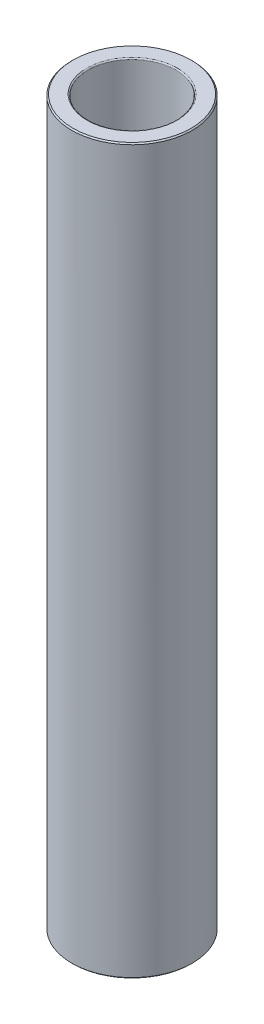
ISO-10303-21;
HEADER;
FILE_DESCRIPTION(('STEP AP214'),'2;1');
FILE_NAME('part.step','',(''),(''),'','','');
FILE_SCHEMA(('AUTOMOTIVE_DESIGN { 1 0 10303 214 1 1 1 1 }'));
ENDSEC;
DATA;
#1=APPLICATION_CONTEXT('core data for automotive mechanical design processes');
#2=APPLICATION_PROTOCOL_DEFINITION('international standard','automotive_design',2000,#1);
#3=PRODUCT_CONTEXT('',#1,'mechanical');
#4=PRODUCT('Part','Part','',(#3));
#5=PRODUCT_RELATED_PRODUCT_CATEGORY('part','',(#4));
#6=PRODUCT_DEFINITION_FORMATION('','',#4);
#7=PRODUCT_DEFINITION_CONTEXT('part definition',#1,'design');
#8=PRODUCT_DEFINITION('design','',#6,#7);
#9=PRODUCT_DEFINITION_SHAPE('','',#8);
#10=(LENGTH_UNIT() NAMED_UNIT(*) SI_UNIT(.MILLI.,.METRE.));
#11=(NAMED_UNIT(*) PLANE_ANGLE_UNIT() SI_UNIT($,.RADIAN.));
#12=(NAMED_UNIT(*) SI_UNIT($,.STERADIAN.) SOLID_ANGLE_UNIT());
#13=UNCERTAINTY_MEASURE_WITH_UNIT(LENGTH_MEASURE(1.E-05),#10,'distance_accuracy_value','');
#14=(GEOMETRIC_REPRESENTATION_CONTEXT(3) GLOBAL_UNCERTAINTY_ASSIGNED_CONTEXT((#13)) GLOBAL_UNIT_ASSIGNED_CONTEXT((#10,
#11,#12)) REPRESENTATION_CONTEXT('',''));
#15=CARTESIAN_POINT('',(0.,0.,0.));
#16=DIRECTION('',(0.,0.,1.));
#17=DIRECTION('',(1.,0.,0.));
#18=AXIS2_PLACEMENT_3D('',#15,#16,#17);
#19=CARTESIAN_POINT('',(0.,152.4,0.));
#20=DIRECTION('',(0.,1.,0.));
#21=DIRECTION('',(0.,0.,1.));
#22=AXIS2_PLACEMENT_3D('',#19,#20,#21);
#23=PLANE('',#22);
#24=CARTESIAN_POINT('',(0.,152.4,0.));
#25=DIRECTION('',(0.,1.,0.));
#26=DIRECTION('',(0.,0.,1.));
#27=AXIS2_PLACEMENT_3D('',#24,#25,#26);
#28=CIRCLE('',#27,9.525);
#29=CARTESIAN_POINT('',(0.,152.4,9.525));
#30=VERTEX_POINT('',#29);
#31=EDGE_CURVE('E11',#30,#30,#28,.F.);
#32=ORIENTED_EDGE('',*,*,#31,.T.);
#33=EDGE_LOOP('',(#32));
#34=FACE_BOUND('',#33,.T.);
#35=CARTESIAN_POINT('',(0.,152.4,0.));
#36=DIRECTION('',(0.,1.,0.));
#37=DIRECTION('',(0.,0.,1.));
#38=AXIS2_PLACEMENT_3D('',#35,#36,#37);
#39=CIRCLE('',#38,12.4460000000001);
#40=CARTESIAN_POINT('',(0.,152.4,12.4460000000001));
#41=VERTEX_POINT('',#40);
#42=EDGE_CURVE('E73',#41,#41,#39,.T.);
#43=ORIENTED_EDGE('',*,*,#42,.T.);
#44=EDGE_LOOP('',(#43));
#45=FACE_BOUND('',#44,.T.);
#46=ADVANCED_FACE('F49',(#34,#45),#23,.T.);
#47=CARTESIAN_POINT('',(0.,0.,0.));
#48=DIRECTION('',(0.,1.,0.));
#49=DIRECTION('',(0.,0.,1.));
#50=AXIS2_PLACEMENT_3D('',#47,#48,#49);
#51=PLANE('',#50);
#52=CARTESIAN_POINT('',(0.,0.,0.));
#53=DIRECTION('',(0.,1.,0.));
#54=DIRECTION('',(0.,0.,1.));
#55=AXIS2_PLACEMENT_3D('',#52,#53,#54);
#56=CIRCLE('',#55,9.525);
#57=CARTESIAN_POINT('',(0.,0.,9.525));
#58=VERTEX_POINT('',#57);
#59=EDGE_CURVE('E67',#58,#58,#56,.T.);
#60=ORIENTED_EDGE('',*,*,#59,.T.);
#61=EDGE_LOOP('',(#60));
#62=FACE_BOUND('',#61,.T.);
#63=CARTESIAN_POINT('',(0.,0.,0.));
#64=DIRECTION('',(0.,1.,0.));
#65=DIRECTION('',(0.,0.,1.));
#66=AXIS2_PLACEMENT_3D('',#63,#64,#65);
#67=CIRCLE('',#66,12.4459999999999);
#68=CARTESIAN_POINT('',(0.,0.,12.4459999999999));
#69=VERTEX_POINT('',#68);
#70=EDGE_CURVE('E77',#69,#69,#67,.F.);
#71=ORIENTED_EDGE('',*,*,#70,.T.);
#72=EDGE_LOOP('',(#71));
#73=FACE_BOUND('',#72,.T.);
#74=ADVANCED_FACE('F101',(#62,#73),#51,.F.);
#75=CARTESIAN_POINT('',(0.,152.4,0.));
#76=DIRECTION('',(0.,-1.,0.));
#77=DIRECTION('',(0.,0.,-1.));
#78=AXIS2_PLACEMENT_3D('',#75,#76,#77);
#79=CYLINDRICAL_SURFACE('',#78,12.7);
#80=CARTESIAN_POINT('',(0.,0.254000000000087,0.));
#81=DIRECTION('',(0.,1.,0.));
#82=DIRECTION('',(0.,0.,1.));
#83=AXIS2_PLACEMENT_3D('',#80,#81,#82);
#84=CIRCLE('',#83,12.7);
#85=CARTESIAN_POINT('',(0.,0.254000000000087,-12.7));
#86=VERTEX_POINT('',#85);
#87=EDGE_CURVE('E81',#86,#86,#84,.T.);
#88=CARTESIAN_POINT('',(0.,152.146,0.));
#89=DIRECTION('',(0.,1.,0.));
#90=DIRECTION('',(0.,0.,1.));
#91=AXIS2_PLACEMENT_3D('',#88,#89,#90);
#92=CIRCLE('',#91,12.7);
#93=CARTESIAN_POINT('',(0.,152.146,-12.7));
#94=VERTEX_POINT('',#93);
#95=EDGE_CURVE('E85',#94,#94,#92,.F.);
#96=CARTESIAN_POINT('',(0.,0.254000000000087,-12.7));
#97=CARTESIAN_POINT('',(0.,1.83620833333342,-12.7));
#98=CARTESIAN_POINT('',(0.,3.41841666666676,-12.7));
#99=CARTESIAN_POINT('',(0.,6.58283333333343,-12.7));
#100=CARTESIAN_POINT('',(0.,8.16504166666676,-12.7));
#101=CARTESIAN_POINT('',(0.,11.3294583333334,-12.7));
#102=CARTESIAN_POINT('',(0.,12.9116666666668,-12.7));
#103=CARTESIAN_POINT('',(0.,16.0760833333334,-12.7));
#104=CARTESIAN_POINT('',(0.,17.6582916666668,-12.7));
#105=CARTESIAN_POINT('',(0.,20.8227083333334,-12.7));
#106=CARTESIAN_POINT('',(0.,22.4049166666668,-12.7));
#107=CARTESIAN_POINT('',(0.,25.5693333333334,-12.7));
#108=CARTESIAN_POINT('',(0.,27.1515416666667,-12.7));
#109=CARTESIAN_POINT('',(0.,30.3159583333334,-12.7));
#110=CARTESIAN_POINT('',(0.,31.8981666666667,-12.7));
#111=CARTESIAN_POINT('',(0.,35.0625833333334,-12.7));
#112=CARTESIAN_POINT('',(0.,36.6447916666667,-12.7));
#113=CARTESIAN_POINT('',(0.,39.8092083333334,-12.7));
#114=CARTESIAN_POINT('',(0.,41.3914166666667,-12.7));
#115=CARTESIAN_POINT('',(0.,44.5558333333334,-12.7));
#116=CARTESIAN_POINT('',(0.,46.1380416666668,-12.7));
#117=CARTESIAN_POINT('',(0.,49.3024583333334,-12.7));
#118=CARTESIAN_POINT('',(0.,50.8846666666668,-12.7));
#119=CARTESIAN_POINT('',(0.,54.0490833333334,-12.7));
#120=CARTESIAN_POINT('',(0.,55.6312916666667,-12.7));
#121=CARTESIAN_POINT('',(0.,58.7957083333334,-12.7));
#122=CARTESIAN_POINT('',(0.,60.3779166666668,-12.7));
#123=CARTESIAN_POINT('',(0.,63.5423333333334,-12.7));
#124=CARTESIAN_POINT('',(0.,65.1245416666667,-12.7));
#125=CARTESIAN_POINT('',(0.,68.2889583333334,-12.7));
#126=CARTESIAN_POINT('',(0.,69.8711666666668,-12.7));
#127=CARTESIAN_POINT('',(0.,73.0355833333334,-12.7));
#128=CARTESIAN_POINT('',(0.,74.6177916666667,-12.7));
#129=CARTESIAN_POINT('',(0.,77.7822083333334,-12.7));
#130=CARTESIAN_POINT('',(0.,79.3644166666668,-12.7));
#131=CARTESIAN_POINT('',(0.,82.5288333333334,-12.7));
#132=CARTESIAN_POINT('',(0.,84.1110416666668,-12.7));
#133=CARTESIAN_POINT('',(0.,87.2754583333334,-12.7));
#134=CARTESIAN_POINT('',(0.,88.8576666666667,-12.7));
#135=CARTESIAN_POINT('',(0.,92.0220833333334,-12.7));
#136=CARTESIAN_POINT('',(0.,93.6042916666668,-12.7));
#137=CARTESIAN_POINT('',(0.,96.7687083333334,-12.7));
#138=CARTESIAN_POINT('',(0.,98.3509166666668,-12.7));
#139=CARTESIAN_POINT('',(0.,101.515333333333,-12.7));
#140=CARTESIAN_POINT('',(0.,103.097541666667,-12.7));
#141=CARTESIAN_POINT('',(0.,106.261958333333,-12.7));
#142=CARTESIAN_POINT('',(0.,107.844166666667,-12.7));
#143=CARTESIAN_POINT('',(0.,111.008583333333,-12.7));
#144=CARTESIAN_POINT('',(0.,112.590791666667,-12.7));
#145=CARTESIAN_POINT('',(0.,115.755208333333,-12.7));
#146=CARTESIAN_POINT('',(0.,117.337416666667,-12.7));
#147=CARTESIAN_POINT('',(0.,120.501833333333,-12.7));
#148=CARTESIAN_POINT('',(0.,122.084041666667,-12.7));
#149=CARTESIAN_POINT('',(0.,125.248458333333,-12.7));
#150=CARTESIAN_POINT('',(0.,126.830666666667,-12.7));
#151=CARTESIAN_POINT('',(0.,129.995083333333,-12.7));
#152=CARTESIAN_POINT('',(0.,131.577291666667,-12.7));
#153=CARTESIAN_POINT('',(0.,134.741708333333,-12.7));
#154=CARTESIAN_POINT('',(0.,136.323916666667,-12.7));
#155=CARTESIAN_POINT('',(0.,139.488333333333,-12.7));
#156=CARTESIAN_POINT('',(0.,141.070541666667,-12.7));
#157=CARTESIAN_POINT('',(0.,144.234958333333,-12.7));
#158=CARTESIAN_POINT('',(0.,145.817166666667,-12.7));
#159=CARTESIAN_POINT('',(0.,148.981583333333,-12.7));
#160=CARTESIAN_POINT('',(0.,150.563791666667,-12.7));
#161=CARTESIAN_POINT('',(0.,152.146,-12.7));
#162=B_SPLINE_CURVE_WITH_KNOTS('',3,(#96,#97,#98,#99,#100,#101,#102,#103,#104,#105,#106,#107,
#108,#109,#110,#111,#112,#113,#114,#115,#116,#117,#118,#119,#120,#121,#122,#123,#124,#125,#126,
#127,#128,#129,#130,#131,#132,#133,#134,#135,#136,#137,#138,#139,#140,#141,#142,#143,#144,#145,
#146,#147,#148,#149,#150,#151,#152,#153,#154,#155,#156,#157,#158,#159,#160,#161),.UNSPECIFIED.,
.F.,.F.,(4,2,2,2,2,2,2,2,2,2,2,2,2,2,2,2,2,2,2,2,2,2,2,2,2,2,2,2,2,2,2,2,4),(0.,4.746625,
9.49325000000001,14.239875,18.9865,23.733125,28.47975,33.226375,37.973,42.719625,47.46625,
52.212875,56.9595,61.706125,66.45275,71.199375,75.946,80.692625,85.43925,90.185875,94.9325,
99.679125,104.42575,109.172375,113.919,118.665625,123.41225,128.158875,132.9055,137.652125,
142.39875,147.145375,151.892),.UNSPECIFIED.);
#163=EDGE_CURVE('BSEAM90',#86,#94,#162,.T.);
#164=ORIENTED_EDGE('',*,*,#87,.T.);
#165=ORIENTED_EDGE('',*,*,#95,.T.);
#166=ORIENTED_EDGE('',*,*,#163,.T.);
#167=ORIENTED_EDGE('',*,*,#163,.F.);
#168=EDGE_LOOP('',(#164,#166,#165,#167));
#169=FACE_BOUND('',#168,.T.);
#170=ADVANCED_FACE('F90',(#169),#79,.T.);
#171=CARTESIAN_POINT('',(0.,152.4,0.));
#172=DIRECTION('',(0.,-1.,0.));
#173=DIRECTION('',(0.,0.,-1.));
#174=AXIS2_PLACEMENT_3D('',#171,#172,#173);
#175=CYLINDRICAL_SURFACE('',#174,9.271);
#176=CARTESIAN_POINT('',(0.,0.254000000000004,0.));
#177=DIRECTION('',(0.,1.,0.));
#178=DIRECTION('',(0.,0.,1.));
#179=AXIS2_PLACEMENT_3D('',#176,#177,#178);
#180=CIRCLE('',#179,9.271);
#181=CARTESIAN_POINT('',(0.,0.253999999999976,-9.271));
#182=VERTEX_POINT('',#181);
#183=EDGE_CURVE('E57',#182,#182,#180,.F.);
#184=CARTESIAN_POINT('',(0.,152.146,0.));
#185=DIRECTION('',(0.,1.,0.));
#186=DIRECTION('',(0.,0.,1.));
#187=AXIS2_PLACEMENT_3D('',#184,#185,#186);
#188=CIRCLE('',#187,9.271);
#189=CARTESIAN_POINT('',(0.,152.146,-9.271));
#190=VERTEX_POINT('',#189);
#191=EDGE_CURVE('E62',#190,#190,#188,.T.);
#192=CARTESIAN_POINT('',(0.,0.253999999999976,-9.271));
#193=CARTESIAN_POINT('',(0.,1.83620833333331,-9.271));
#194=CARTESIAN_POINT('',(0.,3.41841666666665,-9.271));
#195=CARTESIAN_POINT('',(0.,6.58283333333332,-9.271));
#196=CARTESIAN_POINT('',(0.,8.16504166666665,-9.271));
#197=CARTESIAN_POINT('',(0.,11.3294583333333,-9.271));
#198=CARTESIAN_POINT('',(0.,12.9116666666667,-9.271));
#199=CARTESIAN_POINT('',(0.,16.0760833333333,-9.271));
#200=CARTESIAN_POINT('',(0.,17.6582916666667,-9.271));
#201=CARTESIAN_POINT('',(0.,20.8227083333333,-9.271));
#202=CARTESIAN_POINT('',(0.,22.4049166666666,-9.271));
#203=CARTESIAN_POINT('',(0.,25.5693333333333,-9.271));
#204=CARTESIAN_POINT('',(0.,27.1515416666666,-9.271));
#205=CARTESIAN_POINT('',(0.,30.3159583333333,-9.271));
#206=CARTESIAN_POINT('',(0.,31.8981666666666,-9.271));
#207=CARTESIAN_POINT('',(0.,35.0625833333333,-9.271));
#208=CARTESIAN_POINT('',(0.,36.6447916666666,-9.271));
#209=CARTESIAN_POINT('',(0.,39.8092083333333,-9.271));
#210=CARTESIAN_POINT('',(0.,41.3914166666666,-9.271));
#211=CARTESIAN_POINT('',(0.,44.5558333333333,-9.271));
#212=CARTESIAN_POINT('',(0.,46.1380416666666,-9.271));
#213=CARTESIAN_POINT('',(0.,49.3024583333333,-9.271));
#214=CARTESIAN_POINT('',(0.,50.8846666666666,-9.271));
#215=CARTESIAN_POINT('',(0.,54.0490833333333,-9.271));
#216=CARTESIAN_POINT('',(0.,55.6312916666666,-9.271));
#217=CARTESIAN_POINT('',(0.,58.7957083333333,-9.271));
#218=CARTESIAN_POINT('',(0.,60.3779166666666,-9.271));
#219=CARTESIAN_POINT('',(0.,63.5423333333333,-9.271));
#220=CARTESIAN_POINT('',(0.,65.1245416666666,-9.271));
#221=CARTESIAN_POINT('',(0.,68.2889583333333,-9.271));
#222=CARTESIAN_POINT('',(0.,69.8711666666666,-9.271));
#223=CARTESIAN_POINT('',(0.,73.0355833333333,-9.271));
#224=CARTESIAN_POINT('',(0.,74.6177916666666,-9.271));
#225=CARTESIAN_POINT('',(0.,77.7822083333333,-9.271));
#226=CARTESIAN_POINT('',(0.,79.3644166666666,-9.271));
#227=CARTESIAN_POINT('',(0.,82.5288333333333,-9.271));
#228=CARTESIAN_POINT('',(0.,84.1110416666667,-9.271));
#229=CARTESIAN_POINT('',(0.,87.2754583333333,-9.271));
#230=CARTESIAN_POINT('',(0.,88.8576666666666,-9.271));
#231=CARTESIAN_POINT('',(0.,92.0220833333333,-9.271));
#232=CARTESIAN_POINT('',(0.,93.6042916666666,-9.271));
#233=CARTESIAN_POINT('',(0.,96.7687083333333,-9.271));
#234=CARTESIAN_POINT('',(0.,98.3509166666666,-9.271));
#235=CARTESIAN_POINT('',(0.,101.515333333333,-9.271));
#236=CARTESIAN_POINT('',(0.,103.097541666667,-9.271));
#237=CARTESIAN_POINT('',(0.,106.261958333333,-9.271));
#238=CARTESIAN_POINT('',(0.,107.844166666667,-9.271));
#239=CARTESIAN_POINT('',(0.,111.008583333333,-9.271));
#240=CARTESIAN_POINT('',(0.,112.590791666667,-9.271));
#241=CARTESIAN_POINT('',(0.,115.755208333333,-9.271));
#242=CARTESIAN_POINT('',(0.,117.337416666667,-9.271));
#243=CARTESIAN_POINT('',(0.,120.501833333333,-9.271));
#244=CARTESIAN_POINT('',(0.,122.084041666667,-9.271));
#245=CARTESIAN_POINT('',(0.,125.248458333333,-9.271));
#246=CARTESIAN_POINT('',(0.,126.830666666667,-9.271));
#247=CARTESIAN_POINT('',(0.,129.995083333333,-9.271));
#248=CARTESIAN_POINT('',(0.,131.577291666667,-9.271));
#249=CARTESIAN_POINT('',(0.,134.741708333333,-9.271));
#250=CARTESIAN_POINT('',(0.,136.323916666667,-9.271));
#251=CARTESIAN_POINT('',(0.,139.488333333333,-9.271));
#252=CARTESIAN_POINT('',(0.,141.070541666667,-9.271));
#253=CARTESIAN_POINT('',(0.,144.234958333333,-9.271));
#254=CARTESIAN_POINT('',(0.,145.817166666667,-9.271));
#255=CARTESIAN_POINT('',(0.,148.981583333333,-9.271));
#256=CARTESIAN_POINT('',(0.,150.563791666667,-9.271));
#257=CARTESIAN_POINT('',(0.,152.146,-9.271));
#258=B_SPLINE_CURVE_WITH_KNOTS('',3,(#192,#193,#194,#195,#196,#197,#198,#199,#200,#201,#202,
#203,#204,#205,#206,#207,#208,#209,#210,#211,#212,#213,#214,#215,#216,#217,#218,#219,#220,#221,
#222,#223,#224,#225,#226,#227,#228,#229,#230,#231,#232,#233,#234,#235,#236,#237,#238,#239,#240,
#241,#242,#243,#244,#245,#246,#247,#248,#249,#250,#251,#252,#253,#254,#255,#256,#257),
.UNSPECIFIED.,.F.,.F.,(4,2,2,2,2,2,2,2,2,2,2,2,2,2,2,2,2,2,2,2,2,2,2,2,2,2,2,2,2,2,2,2,4),(0.,
4.746625,9.49325000000001,14.239875,18.9865,23.733125,28.47975,33.226375,37.973,42.719625,
47.46625,52.212875,56.9595,61.706125,66.45275,71.199375,75.946,80.692625,85.43925,90.185875,
94.9325,99.679125,104.42575,109.172375,113.919,118.665625,123.41225,128.158875,132.9055,
137.652125,142.39875,147.145375,151.892),.UNSPECIFIED.);
#259=EDGE_CURVE('BSEAM109',#182,#190,#258,.T.);
#260=ORIENTED_EDGE('',*,*,#183,.T.);
#261=ORIENTED_EDGE('',*,*,#191,.T.);
#262=ORIENTED_EDGE('',*,*,#259,.T.);
#263=ORIENTED_EDGE('',*,*,#259,.F.);
#264=EDGE_LOOP('',(#260,#262,#261,#263));
#265=FACE_BOUND('',#264,.T.);
#266=ADVANCED_FACE('F109',(#265),#175,.F.);
#267=CARTESIAN_POINT('',(0.,0.254000000000087,0.));
#268=DIRECTION('',(0.,1.,0.));
#269=DIRECTION('',(0.,0.,1.));
#270=AXIS2_PLACEMENT_3D('',#267,#268,#269);
#271=CONICAL_SURFACE('',#270,12.7,0.785398163397472);
#272=ORIENTED_EDGE('',*,*,#70,.F.);
#273=EDGE_LOOP('',(#272));
#274=FACE_BOUND('',#273,.T.);
#275=ORIENTED_EDGE('',*,*,#87,.F.);
#276=EDGE_LOOP('',(#275));
#277=FACE_BOUND('',#276,.T.);
#278=ADVANCED_FACE('F96',(#274,#277),#271,.T.);
#279=CARTESIAN_POINT('',(0.,152.4,0.));
#280=DIRECTION('',(0.,-1.,0.));
#281=DIRECTION('',(0.,0.,-1.));
#282=AXIS2_PLACEMENT_3D('',#279,#280,#281);
#283=CONICAL_SURFACE('',#282,12.4460000000001,0.785398163397418);
#284=ORIENTED_EDGE('',*,*,#95,.F.);
#285=EDGE_LOOP('',(#284));
#286=FACE_BOUND('',#285,.T.);
#287=ORIENTED_EDGE('',*,*,#42,.F.);
#288=EDGE_LOOP('',(#287));
#289=FACE_BOUND('',#288,.T.);
#290=ADVANCED_FACE('F92',(#286,#289),#283,.T.);
#291=CARTESIAN_POINT('',(0.,0.254000000000004,0.));
#292=DIRECTION('',(0.,1.,0.));
#293=DIRECTION('',(0.,0.,1.));
#294=AXIS2_PLACEMENT_3D('',#291,#292,#293);
#295=TOROIDAL_SURFACE('',#294,9.525,0.254);
#296=ORIENTED_EDGE('',*,*,#183,.F.);
#297=EDGE_LOOP('',(#296));
#298=FACE_BOUND('',#297,.T.);
#299=ORIENTED_EDGE('',*,*,#59,.F.);
#300=EDGE_LOOP('',(#299));
#301=FACE_BOUND('',#300,.T.);
#302=ADVANCED_FACE('F95',(#298,#301),#295,.T.);
#303=CARTESIAN_POINT('',(0.,152.146,0.));
#304=DIRECTION('',(0.,1.,0.));
#305=DIRECTION('',(0.,0.,1.));
#306=AXIS2_PLACEMENT_3D('',#303,#304,#305);
#307=TOROIDAL_SURFACE('',#306,9.525,0.254);
#308=ORIENTED_EDGE('',*,*,#31,.F.);
#309=EDGE_LOOP('',(#308));
#310=FACE_BOUND('',#309,.T.);
#311=ORIENTED_EDGE('',*,*,#191,.F.);
#312=EDGE_LOOP('',(#311));
#313=FACE_BOUND('',#312,.T.);
#314=ADVANCED_FACE('F51',(#310,#313),#307,.T.);
#315=CLOSED_SHELL('',(#46,#74,#170,#266,#278,#290,#302,#314));
#316=MANIFOLD_SOLID_BREP('B2',#315);
#317=ADVANCED_BREP_SHAPE_REPRESENTATION('',(#18,#316),#14);
#318=SHAPE_DEFINITION_REPRESENTATION(#9,#317);
ENDSEC;
END-ISO-10303-21;
